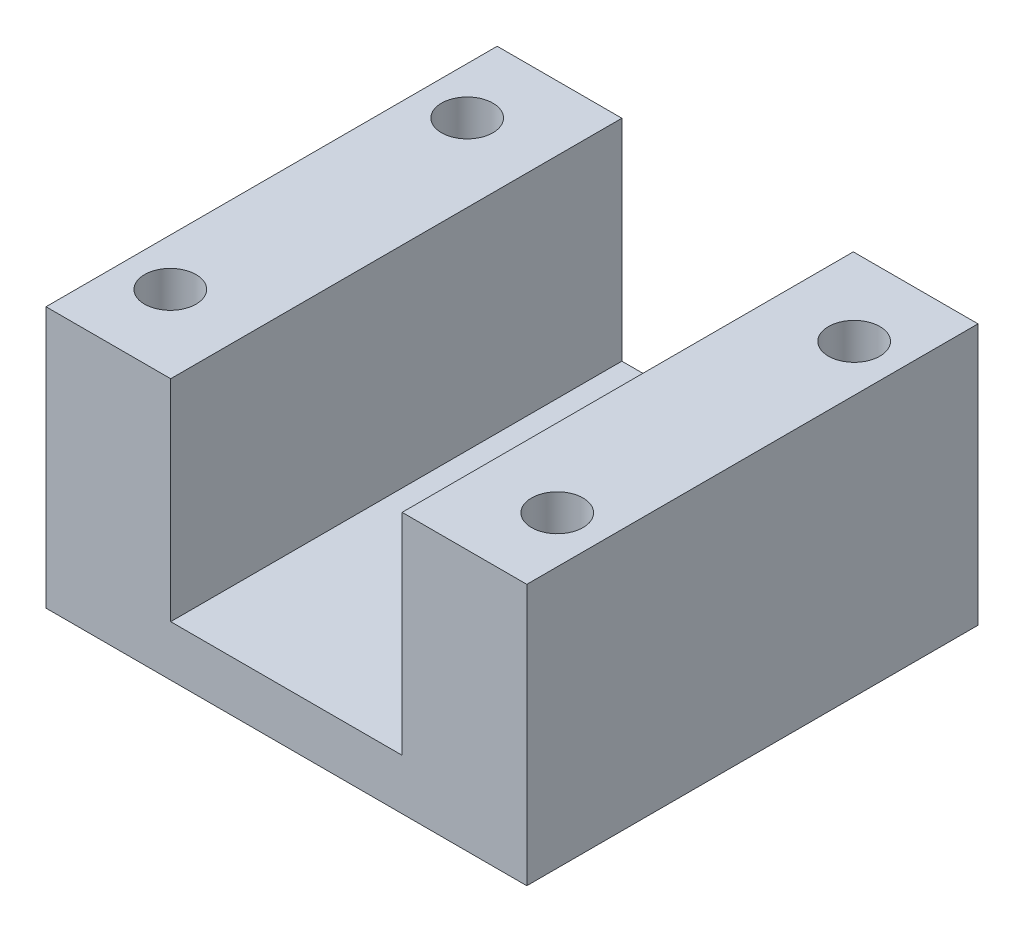
ISO-10303-21;
HEADER;
FILE_DESCRIPTION(('STEP AP214'),'2;1');
FILE_NAME('part.step','',(''),(''),'','','');
FILE_SCHEMA(('AUTOMOTIVE_DESIGN { 1 0 10303 214 1 1 1 1 }'));
ENDSEC;
DATA;
#1=APPLICATION_CONTEXT('core data for automotive mechanical design processes');
#2=APPLICATION_PROTOCOL_DEFINITION('international standard','automotive_design',2000,#1);
#3=PRODUCT_CONTEXT('',#1,'mechanical');
#4=PRODUCT('Part','Part','',(#3));
#5=PRODUCT_RELATED_PRODUCT_CATEGORY('part','',(#4));
#6=PRODUCT_DEFINITION_FORMATION('','',#4);
#7=PRODUCT_DEFINITION_CONTEXT('part definition',#1,'design');
#8=PRODUCT_DEFINITION('design','',#6,#7);
#9=PRODUCT_DEFINITION_SHAPE('','',#8);
#10=(LENGTH_UNIT() NAMED_UNIT(*) SI_UNIT(.MILLI.,.METRE.));
#11=(NAMED_UNIT(*) PLANE_ANGLE_UNIT() SI_UNIT($,.RADIAN.));
#12=(NAMED_UNIT(*) SI_UNIT($,.STERADIAN.) SOLID_ANGLE_UNIT());
#13=UNCERTAINTY_MEASURE_WITH_UNIT(LENGTH_MEASURE(1.E-05),#10,'distance_accuracy_value','');
#14=(GEOMETRIC_REPRESENTATION_CONTEXT(3) GLOBAL_UNCERTAINTY_ASSIGNED_CONTEXT((#13)) GLOBAL_UNIT_ASSIGNED_CONTEXT((#10,
#11,#12)) REPRESENTATION_CONTEXT('',''));
#15=CARTESIAN_POINT('',(0.,0.,0.));
#16=DIRECTION('',(0.,0.,1.));
#17=DIRECTION('',(1.,0.,0.));
#18=AXIS2_PLACEMENT_3D('',#15,#16,#17);
#19=CARTESIAN_POINT('',(55.7022,0.,47.994));
#20=DIRECTION('',(0.,1.,0.));
#21=DIRECTION('',(0.,0.,1.));
#22=AXIS2_PLACEMENT_3D('',#19,#20,#21);
#23=CYLINDRICAL_SURFACE('',#22,3.3);
#24=CARTESIAN_POINT('',(55.7022,0.,47.994));
#25=DIRECTION('',(0.,1.,0.));
#26=DIRECTION('',(0.,0.,1.));
#27=AXIS2_PLACEMENT_3D('',#24,#25,#26);
#28=CIRCLE('',#27,3.3);
#29=CARTESIAN_POINT('',(55.7022,0.,51.294));
#30=VERTEX_POINT('',#29);
#31=EDGE_CURVE('E184',#30,#30,#28,.T.);
#32=ORIENTED_EDGE('',*,*,#31,.F.);
#33=EDGE_LOOP('',(#32));
#34=FACE_BOUND('',#33,.T.);
#35=CARTESIAN_POINT('',(55.7022,33.5,47.994));
#36=DIRECTION('',(0.,1.,0.));
#37=DIRECTION('',(-1.,0.,0.));
#38=AXIS2_PLACEMENT_3D('',#35,#36,#37);
#39=CIRCLE('',#38,3.3);
#40=CARTESIAN_POINT('',(52.4022,33.5,47.994));
#41=VERTEX_POINT('',#40);
#42=EDGE_CURVE('E191',#41,#41,#39,.T.);
#43=ORIENTED_EDGE('',*,*,#42,.T.);
#44=EDGE_LOOP('',(#43));
#45=FACE_BOUND('',#44,.T.);
#46=ADVANCED_FACE('F17',(#34,#45),#23,.F.);
#47=CARTESIAN_POINT('',(55.7022,0.,9.894));
#48=DIRECTION('',(0.,1.,0.));
#49=DIRECTION('',(0.,0.,1.));
#50=AXIS2_PLACEMENT_3D('',#47,#48,#49);
#51=CYLINDRICAL_SURFACE('',#50,3.3);
#52=CARTESIAN_POINT('',(55.7022,0.,9.894));
#53=DIRECTION('',(0.,1.,0.));
#54=DIRECTION('',(0.,0.,1.));
#55=AXIS2_PLACEMENT_3D('',#52,#53,#54);
#56=CIRCLE('',#55,3.3);
#57=CARTESIAN_POINT('',(55.7022,0.,13.194));
#58=VERTEX_POINT('',#57);
#59=EDGE_CURVE('E203',#58,#58,#56,.T.);
#60=ORIENTED_EDGE('',*,*,#59,.F.);
#61=EDGE_LOOP('',(#60));
#62=FACE_BOUND('',#61,.T.);
#63=CARTESIAN_POINT('',(55.7022,33.5,9.894));
#64=DIRECTION('',(0.,1.,0.));
#65=DIRECTION('',(-1.,0.,0.));
#66=AXIS2_PLACEMENT_3D('',#63,#64,#65);
#67=CIRCLE('',#66,3.3);
#68=CARTESIAN_POINT('',(52.4022,33.5,9.894));
#69=VERTEX_POINT('',#68);
#70=EDGE_CURVE('E40',#69,#69,#67,.T.);
#71=ORIENTED_EDGE('',*,*,#70,.T.);
#72=EDGE_LOOP('',(#71));
#73=FACE_BOUND('',#72,.T.);
#74=ADVANCED_FACE('F19',(#62,#73),#51,.F.);
#75=CARTESIAN_POINT('',(6.0452,0.,47.994));
#76=DIRECTION('',(0.,1.,0.));
#77=DIRECTION('',(0.,0.,1.));
#78=AXIS2_PLACEMENT_3D('',#75,#76,#77);
#79=CYLINDRICAL_SURFACE('',#78,3.3);
#80=CARTESIAN_POINT('',(6.0452,0.,47.994));
#81=DIRECTION('',(0.,1.,0.));
#82=DIRECTION('',(0.,0.,1.));
#83=AXIS2_PLACEMENT_3D('',#80,#81,#82);
#84=CIRCLE('',#83,3.3);
#85=CARTESIAN_POINT('',(6.0452,0.,51.294));
#86=VERTEX_POINT('',#85);
#87=EDGE_CURVE('E199',#86,#86,#84,.T.);
#88=ORIENTED_EDGE('',*,*,#87,.F.);
#89=EDGE_LOOP('',(#88));
#90=FACE_BOUND('',#89,.T.);
#91=CARTESIAN_POINT('',(6.0452,33.5,47.994));
#92=DIRECTION('',(0.,1.,0.));
#93=DIRECTION('',(0.,0.,1.));
#94=AXIS2_PLACEMENT_3D('',#91,#92,#93);
#95=CIRCLE('',#94,3.3);
#96=CARTESIAN_POINT('',(6.0452,33.5,51.294));
#97=VERTEX_POINT('',#96);
#98=EDGE_CURVE('E165',#97,#97,#95,.T.);
#99=ORIENTED_EDGE('',*,*,#98,.T.);
#100=EDGE_LOOP('',(#99));
#101=FACE_BOUND('',#100,.T.);
#102=ADVANCED_FACE('F313',(#90,#101),#79,.F.);
#103=CARTESIAN_POINT('',(6.0452,0.,9.894));
#104=DIRECTION('',(0.,1.,0.));
#105=DIRECTION('',(0.,0.,1.));
#106=AXIS2_PLACEMENT_3D('',#103,#104,#105);
#107=CYLINDRICAL_SURFACE('',#106,3.3);
#108=CARTESIAN_POINT('',(6.0452,0.,9.894));
#109=DIRECTION('',(0.,1.,0.));
#110=DIRECTION('',(0.,0.,1.));
#111=AXIS2_PLACEMENT_3D('',#108,#109,#110);
#112=CIRCLE('',#111,3.3);
#113=CARTESIAN_POINT('',(6.0452,0.,13.194));
#114=VERTEX_POINT('',#113);
#115=EDGE_CURVE('E202',#114,#114,#112,.T.);
#116=ORIENTED_EDGE('',*,*,#115,.F.);
#117=EDGE_LOOP('',(#116));
#118=FACE_BOUND('',#117,.T.);
#119=CARTESIAN_POINT('',(6.0452,33.5,9.894));
#120=DIRECTION('',(0.,1.,0.));
#121=DIRECTION('',(0.,0.,1.));
#122=AXIS2_PLACEMENT_3D('',#119,#120,#121);
#123=CIRCLE('',#122,3.3);
#124=CARTESIAN_POINT('',(6.0452,33.5,13.194));
#125=VERTEX_POINT('',#124);
#126=EDGE_CURVE('E156',#125,#125,#123,.T.);
#127=ORIENTED_EDGE('',*,*,#126,.T.);
#128=EDGE_LOOP('',(#127));
#129=FACE_BOUND('',#128,.T.);
#130=ADVANCED_FACE('F310',(#118,#129),#107,.F.);
#131=CARTESIAN_POINT('',(0.,0.,0.));
#132=DIRECTION('',(0.,0.,-1.));
#133=DIRECTION('',(0.,-1.,0.));
#134=AXIS2_PLACEMENT_3D('',#131,#132,#133);
#135=PLANE('',#134);
#136=DIRECTION('',(0.,-1.,0.));
#137=VECTOR('',#136,1.);
#138=CARTESIAN_POINT('',(61.7,33.5,0.));
#139=LINE('',#138,#137);
#140=CARTESIAN_POINT('',(61.7,33.5,0.));
#141=VERTEX_POINT('',#140);
#142=CARTESIAN_POINT('',(61.7,0.,0.));
#143=VERTEX_POINT('',#142);
#144=EDGE_CURVE('E242',#141,#143,#139,.T.);
#145=ORIENTED_EDGE('',*,*,#144,.T.);
#146=DIRECTION('',(-1.,0.,0.));
#147=VECTOR('',#146,1.);
#148=CARTESIAN_POINT('',(61.7,0.,0.));
#149=LINE('',#148,#147);
#150=CARTESIAN_POINT('',(0.,0.,0.));
#151=VERTEX_POINT('',#150);
#152=EDGE_CURVE('E170',#143,#151,#149,.T.);
#153=ORIENTED_EDGE('',*,*,#152,.T.);
#154=DIRECTION('',(0.,1.,0.));
#155=VECTOR('',#154,1.);
#156=CARTESIAN_POINT('',(0.,0.,0.));
#157=LINE('',#156,#155);
#158=CARTESIAN_POINT('',(0.,33.5,0.));
#159=VERTEX_POINT('',#158);
#160=EDGE_CURVE('E161',#151,#159,#157,.T.);
#161=ORIENTED_EDGE('',*,*,#160,.T.);
#162=DIRECTION('',(1.,0.,0.));
#163=VECTOR('',#162,1.);
#164=CARTESIAN_POINT('',(0.,33.5,0.));
#165=LINE('',#164,#163);
#166=CARTESIAN_POINT('',(16.,33.5,0.));
#167=VERTEX_POINT('',#166);
#168=EDGE_CURVE('E144',#159,#167,#165,.T.);
#169=ORIENTED_EDGE('',*,*,#168,.T.);
#170=DIRECTION('',(0.,-1.,0.));
#171=VECTOR('',#170,1.);
#172=CARTESIAN_POINT('',(16.,33.5,0.));
#173=LINE('',#172,#171);
#174=CARTESIAN_POINT('',(16.,6.5,0.));
#175=VERTEX_POINT('',#174);
#176=EDGE_CURVE('E222',#167,#175,#173,.T.);
#177=ORIENTED_EDGE('',*,*,#176,.T.);
#178=DIRECTION('',(1.,0.,0.));
#179=VECTOR('',#178,1.);
#180=CARTESIAN_POINT('',(16.,6.5,0.));
#181=LINE('',#180,#179);
#182=CARTESIAN_POINT('',(45.7,6.5,0.));
#183=VERTEX_POINT('',#182);
#184=EDGE_CURVE('E198',#175,#183,#181,.T.);
#185=ORIENTED_EDGE('',*,*,#184,.T.);
#186=DIRECTION('',(0.,1.,0.));
#187=VECTOR('',#186,1.);
#188=CARTESIAN_POINT('',(45.7,6.5,0.));
#189=LINE('',#188,#187);
#190=CARTESIAN_POINT('',(45.7,33.5,0.));
#191=VERTEX_POINT('',#190);
#192=EDGE_CURVE('E108',#183,#191,#189,.T.);
#193=ORIENTED_EDGE('',*,*,#192,.T.);
#194=DIRECTION('',(1.,0.,0.));
#195=VECTOR('',#194,1.);
#196=CARTESIAN_POINT('',(45.7,33.5,0.));
#197=LINE('',#196,#195);
#198=EDGE_CURVE('E28',#191,#141,#197,.T.);
#199=ORIENTED_EDGE('',*,*,#198,.T.);
#200=EDGE_LOOP('',(#145,#153,#161,#169,#177,#185,#193,#199));
#201=FACE_BOUND('',#200,.T.);
#202=ADVANCED_FACE('F169',(#201),#135,.T.);
#203=CARTESIAN_POINT('',(0.,0.,57.9));
#204=DIRECTION('',(0.,0.,-1.));
#205=DIRECTION('',(0.,-1.,0.));
#206=AXIS2_PLACEMENT_3D('',#203,#204,#205);
#207=PLANE('',#206);
#208=DIRECTION('',(0.,-1.,0.));
#209=VECTOR('',#208,1.);
#210=CARTESIAN_POINT('',(61.7,33.5,57.9));
#211=LINE('',#210,#209);
#212=CARTESIAN_POINT('',(61.7,33.5,57.9));
#213=VERTEX_POINT('',#212);
#214=CARTESIAN_POINT('',(61.7,0.,57.9));
#215=VERTEX_POINT('',#214);
#216=EDGE_CURVE('E209',#213,#215,#211,.T.);
#217=ORIENTED_EDGE('',*,*,#216,.F.);
#218=DIRECTION('',(1.,0.,0.));
#219=VECTOR('',#218,1.);
#220=CARTESIAN_POINT('',(45.7,33.5,57.9));
#221=LINE('',#220,#219);
#222=CARTESIAN_POINT('',(45.7,33.5,57.9));
#223=VERTEX_POINT('',#222);
#224=EDGE_CURVE('E11',#223,#213,#221,.T.);
#225=ORIENTED_EDGE('',*,*,#224,.F.);
#226=DIRECTION('',(0.,1.,0.));
#227=VECTOR('',#226,1.);
#228=CARTESIAN_POINT('',(45.7,6.5,57.9));
#229=LINE('',#228,#227);
#230=CARTESIAN_POINT('',(45.7,6.5,57.9));
#231=VERTEX_POINT('',#230);
#232=EDGE_CURVE('E194',#231,#223,#229,.T.);
#233=ORIENTED_EDGE('',*,*,#232,.F.);
#234=DIRECTION('',(1.,0.,0.));
#235=VECTOR('',#234,1.);
#236=CARTESIAN_POINT('',(16.,6.5,57.9));
#237=LINE('',#236,#235);
#238=CARTESIAN_POINT('',(16.,6.5,57.9));
#239=VERTEX_POINT('',#238);
#240=EDGE_CURVE('E120',#239,#231,#237,.T.);
#241=ORIENTED_EDGE('',*,*,#240,.F.);
#242=DIRECTION('',(0.,-1.,0.));
#243=VECTOR('',#242,1.);
#244=CARTESIAN_POINT('',(16.,33.5,57.9));
#245=LINE('',#244,#243);
#246=CARTESIAN_POINT('',(16.,33.5,57.9));
#247=VERTEX_POINT('',#246);
#248=EDGE_CURVE('E219',#247,#239,#245,.T.);
#249=ORIENTED_EDGE('',*,*,#248,.F.);
#250=DIRECTION('',(1.,0.,0.));
#251=VECTOR('',#250,1.);
#252=CARTESIAN_POINT('',(0.,33.5,57.9));
#253=LINE('',#252,#251);
#254=CARTESIAN_POINT('',(0.,33.5,57.9));
#255=VERTEX_POINT('',#254);
#256=EDGE_CURVE('E21',#255,#247,#253,.T.);
#257=ORIENTED_EDGE('',*,*,#256,.F.);
#258=DIRECTION('',(0.,1.,0.));
#259=VECTOR('',#258,1.);
#260=CARTESIAN_POINT('',(0.,0.,57.9));
#261=LINE('',#260,#259);
#262=CARTESIAN_POINT('',(0.,0.,57.9));
#263=VERTEX_POINT('',#262);
#264=EDGE_CURVE('E163',#263,#255,#261,.T.);
#265=ORIENTED_EDGE('',*,*,#264,.F.);
#266=DIRECTION('',(-1.,0.,0.));
#267=VECTOR('',#266,1.);
#268=CARTESIAN_POINT('',(61.7,0.,57.9));
#269=LINE('',#268,#267);
#270=EDGE_CURVE('E180',#215,#263,#269,.T.);
#271=ORIENTED_EDGE('',*,*,#270,.F.);
#272=EDGE_LOOP('',(#217,#225,#233,#241,#249,#257,#265,#271));
#273=FACE_BOUND('',#272,.T.);
#274=ADVANCED_FACE('F269',(#273),#207,.F.);
#275=CARTESIAN_POINT('',(45.7,33.5,57.9));
#276=DIRECTION('',(0.,1.,0.));
#277=DIRECTION('',(1.,0.,0.));
#278=AXIS2_PLACEMENT_3D('',#275,#276,#277);
#279=PLANE('',#278);
#280=ORIENTED_EDGE('',*,*,#198,.F.);
#281=DIRECTION('',(0.,0.,-1.));
#282=VECTOR('',#281,1.);
#283=CARTESIAN_POINT('',(45.7,33.5,57.9));
#284=LINE('',#283,#282);
#285=EDGE_CURVE('E192',#223,#191,#284,.T.);
#286=ORIENTED_EDGE('',*,*,#285,.F.);
#287=ORIENTED_EDGE('',*,*,#224,.T.);
#288=DIRECTION('',(0.,0.,-1.));
#289=VECTOR('',#288,1.);
#290=CARTESIAN_POINT('',(61.7,33.5,57.9));
#291=LINE('',#290,#289);
#292=EDGE_CURVE('E245',#213,#141,#291,.T.);
#293=ORIENTED_EDGE('',*,*,#292,.T.);
#294=EDGE_LOOP('',(#280,#286,#287,#293));
#295=FACE_BOUND('',#294,.T.);
#296=ORIENTED_EDGE('',*,*,#70,.F.);
#297=EDGE_LOOP('',(#296));
#298=FACE_BOUND('',#297,.T.);
#299=ORIENTED_EDGE('',*,*,#42,.F.);
#300=EDGE_LOOP('',(#299));
#301=FACE_BOUND('',#300,.T.);
#302=ADVANCED_FACE('F292',(#295,#298,#301),#279,.T.);
#303=CARTESIAN_POINT('',(45.7,6.5,57.9));
#304=DIRECTION('',(-1.,0.,0.));
#305=DIRECTION('',(0.,0.,1.));
#306=AXIS2_PLACEMENT_3D('',#303,#304,#305);
#307=PLANE('',#306);
#308=ORIENTED_EDGE('',*,*,#192,.F.);
#309=DIRECTION('',(0.,0.,-1.));
#310=VECTOR('',#309,1.);
#311=CARTESIAN_POINT('',(45.7,6.5,57.9));
#312=LINE('',#311,#310);
#313=EDGE_CURVE('E186',#231,#183,#312,.T.);
#314=ORIENTED_EDGE('',*,*,#313,.F.);
#315=ORIENTED_EDGE('',*,*,#232,.T.);
#316=ORIENTED_EDGE('',*,*,#285,.T.);
#317=EDGE_LOOP('',(#308,#314,#315,#316));
#318=FACE_BOUND('',#317,.T.);
#319=ADVANCED_FACE('F294',(#318),#307,.T.);
#320=CARTESIAN_POINT('',(16.,6.5,57.9));
#321=DIRECTION('',(0.,1.,0.));
#322=DIRECTION('',(1.,0.,0.));
#323=AXIS2_PLACEMENT_3D('',#320,#321,#322);
#324=PLANE('',#323);
#325=ORIENTED_EDGE('',*,*,#184,.F.);
#326=DIRECTION('',(0.,0.,-1.));
#327=VECTOR('',#326,1.);
#328=CARTESIAN_POINT('',(16.,6.5,57.9));
#329=LINE('',#328,#327);
#330=EDGE_CURVE('E213',#239,#175,#329,.T.);
#331=ORIENTED_EDGE('',*,*,#330,.F.);
#332=ORIENTED_EDGE('',*,*,#240,.T.);
#333=ORIENTED_EDGE('',*,*,#313,.T.);
#334=EDGE_LOOP('',(#325,#331,#332,#333));
#335=FACE_BOUND('',#334,.T.);
#336=ADVANCED_FACE('F301',(#335),#324,.T.);
#337=CARTESIAN_POINT('',(16.,33.5,57.9));
#338=DIRECTION('',(1.,0.,0.));
#339=DIRECTION('',(0.,1.,0.));
#340=AXIS2_PLACEMENT_3D('',#337,#338,#339);
#341=PLANE('',#340);
#342=ORIENTED_EDGE('',*,*,#176,.F.);
#343=DIRECTION('',(0.,0.,-1.));
#344=VECTOR('',#343,1.);
#345=CARTESIAN_POINT('',(16.,33.5,57.9));
#346=LINE('',#345,#344);
#347=EDGE_CURVE('E151',#247,#167,#346,.T.);
#348=ORIENTED_EDGE('',*,*,#347,.F.);
#349=ORIENTED_EDGE('',*,*,#248,.T.);
#350=ORIENTED_EDGE('',*,*,#330,.T.);
#351=EDGE_LOOP('',(#342,#348,#349,#350));
#352=FACE_BOUND('',#351,.T.);
#353=ADVANCED_FACE('F307',(#352),#341,.T.);
#354=CARTESIAN_POINT('',(0.,33.5,57.9));
#355=DIRECTION('',(0.,1.,0.));
#356=DIRECTION('',(1.,0.,0.));
#357=AXIS2_PLACEMENT_3D('',#354,#355,#356);
#358=PLANE('',#357);
#359=ORIENTED_EDGE('',*,*,#168,.F.);
#360=DIRECTION('',(0.,0.,-1.));
#361=VECTOR('',#360,1.);
#362=CARTESIAN_POINT('',(0.,33.5,57.9));
#363=LINE('',#362,#361);
#364=EDGE_CURVE('E148',#255,#159,#363,.T.);
#365=ORIENTED_EDGE('',*,*,#364,.F.);
#366=ORIENTED_EDGE('',*,*,#256,.T.);
#367=ORIENTED_EDGE('',*,*,#347,.T.);
#368=EDGE_LOOP('',(#359,#365,#366,#367));
#369=FACE_BOUND('',#368,.T.);
#370=ORIENTED_EDGE('',*,*,#126,.F.);
#371=EDGE_LOOP('',(#370));
#372=FACE_BOUND('',#371,.T.);
#373=ORIENTED_EDGE('',*,*,#98,.F.);
#374=EDGE_LOOP('',(#373));
#375=FACE_BOUND('',#374,.T.);
#376=ADVANCED_FACE('F146',(#369,#372,#375),#358,.T.);
#377=CARTESIAN_POINT('',(0.,0.,57.9));
#378=DIRECTION('',(-1.,0.,0.));
#379=DIRECTION('',(0.,1.,0.));
#380=AXIS2_PLACEMENT_3D('',#377,#378,#379);
#381=PLANE('',#380);
#382=ORIENTED_EDGE('',*,*,#160,.F.);
#383=DIRECTION('',(0.,0.,-1.));
#384=VECTOR('',#383,1.);
#385=CARTESIAN_POINT('',(0.,0.,57.9));
#386=LINE('',#385,#384);
#387=EDGE_CURVE('E172',#263,#151,#386,.T.);
#388=ORIENTED_EDGE('',*,*,#387,.F.);
#389=ORIENTED_EDGE('',*,*,#264,.T.);
#390=ORIENTED_EDGE('',*,*,#364,.T.);
#391=EDGE_LOOP('',(#382,#388,#389,#390));
#392=FACE_BOUND('',#391,.T.);
#393=ADVANCED_FACE('F159',(#392),#381,.T.);
#394=CARTESIAN_POINT('',(61.7,0.,57.9));
#395=DIRECTION('',(0.,-1.,0.));
#396=DIRECTION('',(0.,0.,-1.));
#397=AXIS2_PLACEMENT_3D('',#394,#395,#396);
#398=PLANE('',#397);
#399=ORIENTED_EDGE('',*,*,#152,.F.);
#400=DIRECTION('',(0.,0.,-1.));
#401=VECTOR('',#400,1.);
#402=CARTESIAN_POINT('',(61.7,0.,57.9));
#403=LINE('',#402,#401);
#404=EDGE_CURVE('E205',#215,#143,#403,.T.);
#405=ORIENTED_EDGE('',*,*,#404,.F.);
#406=ORIENTED_EDGE('',*,*,#270,.T.);
#407=ORIENTED_EDGE('',*,*,#387,.T.);
#408=EDGE_LOOP('',(#399,#405,#406,#407));
#409=FACE_BOUND('',#408,.T.);
#410=ORIENTED_EDGE('',*,*,#115,.T.);
#411=EDGE_LOOP('',(#410));
#412=FACE_BOUND('',#411,.T.);
#413=ORIENTED_EDGE('',*,*,#87,.T.);
#414=EDGE_LOOP('',(#413));
#415=FACE_BOUND('',#414,.T.);
#416=ORIENTED_EDGE('',*,*,#59,.T.);
#417=EDGE_LOOP('',(#416));
#418=FACE_BOUND('',#417,.T.);
#419=ORIENTED_EDGE('',*,*,#31,.T.);
#420=EDGE_LOOP('',(#419));
#421=FACE_BOUND('',#420,.T.);
#422=ADVANCED_FACE('F272',(#409,#412,#415,#418,#421),#398,.T.);
#423=CARTESIAN_POINT('',(61.7,33.5,57.9));
#424=DIRECTION('',(1.,0.,0.));
#425=DIRECTION('',(0.,1.,0.));
#426=AXIS2_PLACEMENT_3D('',#423,#424,#425);
#427=PLANE('',#426);
#428=ORIENTED_EDGE('',*,*,#144,.F.);
#429=ORIENTED_EDGE('',*,*,#292,.F.);
#430=ORIENTED_EDGE('',*,*,#216,.T.);
#431=ORIENTED_EDGE('',*,*,#404,.T.);
#432=EDGE_LOOP('',(#428,#429,#430,#431));
#433=FACE_BOUND('',#432,.T.);
#434=ADVANCED_FACE('F266',(#433),#427,.T.);
#435=CLOSED_SHELL('',(#46,#74,#102,#130,#202,#274,#302,#319,#336,#353,#376,#393,#422,#434));
#436=MANIFOLD_SOLID_BREP('B1',#435);
#437=ADVANCED_BREP_SHAPE_REPRESENTATION('',(#18,#436),#14);
#438=SHAPE_DEFINITION_REPRESENTATION(#9,#437);
ENDSEC;
END-ISO-10303-21;
